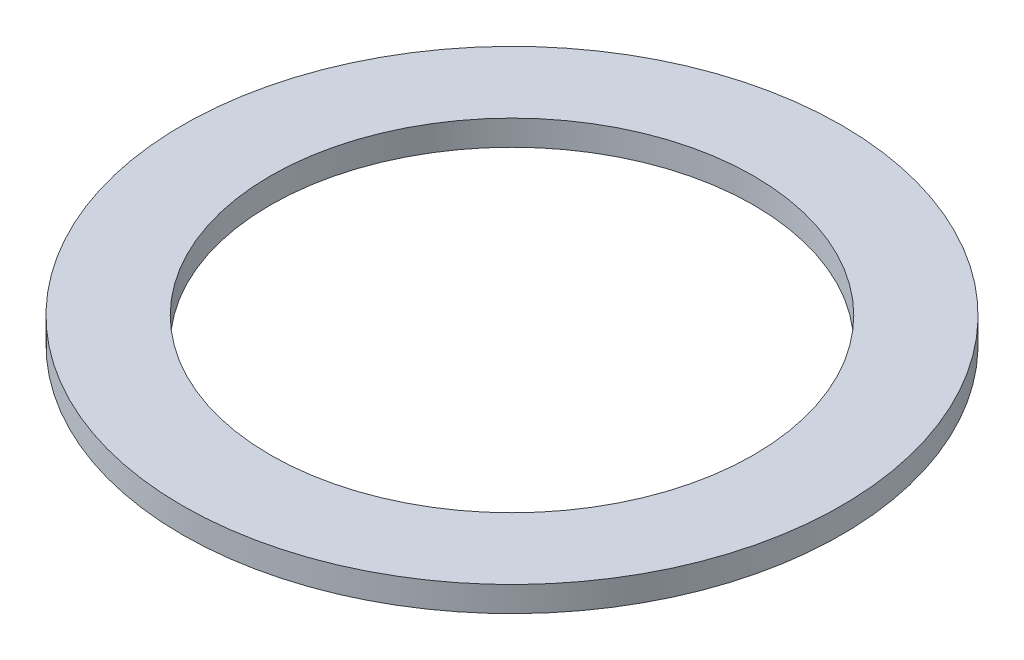
ISO-10303-21;
HEADER;
FILE_DESCRIPTION(('STEP AP214'),'2;1');
FILE_NAME('part.step','',(''),(''),'','','');
FILE_SCHEMA(('AUTOMOTIVE_DESIGN { 1 0 10303 214 1 1 1 1 }'));
ENDSEC;
DATA;
#1=APPLICATION_CONTEXT('core data for automotive mechanical design processes');
#2=APPLICATION_PROTOCOL_DEFINITION('international standard','automotive_design',2000,#1);
#3=PRODUCT_CONTEXT('',#1,'mechanical');
#4=PRODUCT('Part','Part','',(#3));
#5=PRODUCT_RELATED_PRODUCT_CATEGORY('part','',(#4));
#6=PRODUCT_DEFINITION_FORMATION('','',#4);
#7=PRODUCT_DEFINITION_CONTEXT('part definition',#1,'design');
#8=PRODUCT_DEFINITION('design','',#6,#7);
#9=PRODUCT_DEFINITION_SHAPE('','',#8);
#10=(LENGTH_UNIT() NAMED_UNIT(*) SI_UNIT(.MILLI.,.METRE.));
#11=(NAMED_UNIT(*) PLANE_ANGLE_UNIT() SI_UNIT($,.RADIAN.));
#12=(NAMED_UNIT(*) SI_UNIT($,.STERADIAN.) SOLID_ANGLE_UNIT());
#13=UNCERTAINTY_MEASURE_WITH_UNIT(LENGTH_MEASURE(1.E-05),#10,'distance_accuracy_value','');
#14=(GEOMETRIC_REPRESENTATION_CONTEXT(3) GLOBAL_UNCERTAINTY_ASSIGNED_CONTEXT((#13)) GLOBAL_UNIT_ASSIGNED_CONTEXT((#10,
#11,#12)) REPRESENTATION_CONTEXT('',''));
#15=CARTESIAN_POINT('',(0.,0.,0.));
#16=DIRECTION('',(0.,0.,1.));
#17=DIRECTION('',(1.,0.,0.));
#18=AXIS2_PLACEMENT_3D('',#15,#16,#17);
#19=CARTESIAN_POINT('',(0.,2.87,0.));
#20=DIRECTION('',(0.,1.,0.));
#21=DIRECTION('',(0.,0.,1.));
#22=AXIS2_PLACEMENT_3D('',#19,#20,#21);
#23=PLANE('',#22);
#24=CARTESIAN_POINT('',(0.,2.87,0.));
#25=DIRECTION('',(0.,1.,0.));
#26=DIRECTION('',(0.,0.,1.));
#27=AXIS2_PLACEMENT_3D('',#24,#25,#26);
#28=CIRCLE('',#27,37.5);
#29=CARTESIAN_POINT('',(0.,2.87,37.5));
#30=VERTEX_POINT('',#29);
#31=EDGE_CURVE('E10',#30,#30,#28,.T.);
#32=ORIENTED_EDGE('',*,*,#31,.T.);
#33=EDGE_LOOP('',(#32));
#34=FACE_BOUND('',#33,.T.);
#35=CARTESIAN_POINT('',(0.,2.87,0.));
#36=DIRECTION('',(0.,1.,0.));
#37=DIRECTION('',(0.,0.,1.));
#38=AXIS2_PLACEMENT_3D('',#35,#36,#37);
#39=CIRCLE('',#38,27.5);
#40=CARTESIAN_POINT('',(0.,2.87,27.5));
#41=VERTEX_POINT('',#40);
#42=EDGE_CURVE('E42',#41,#41,#39,.T.);
#43=ORIENTED_EDGE('',*,*,#42,.F.);
#44=EDGE_LOOP('',(#43));
#45=FACE_BOUND('',#44,.T.);
#46=ADVANCED_FACE('F31',(#34,#45),#23,.T.);
#47=CARTESIAN_POINT('',(0.,0.,0.));
#48=DIRECTION('',(0.,1.,0.));
#49=DIRECTION('',(0.,0.,1.));
#50=AXIS2_PLACEMENT_3D('',#47,#48,#49);
#51=PLANE('',#50);
#52=CARTESIAN_POINT('',(0.,0.,0.));
#53=DIRECTION('',(0.,1.,0.));
#54=DIRECTION('',(0.,0.,1.));
#55=AXIS2_PLACEMENT_3D('',#52,#53,#54);
#56=CIRCLE('',#55,37.5);
#57=CARTESIAN_POINT('',(0.,0.,37.5));
#58=VERTEX_POINT('',#57);
#59=EDGE_CURVE('E35',#58,#58,#56,.T.);
#60=ORIENTED_EDGE('',*,*,#59,.F.);
#61=EDGE_LOOP('',(#60));
#62=FACE_BOUND('',#61,.T.);
#63=CARTESIAN_POINT('',(0.,0.,0.));
#64=DIRECTION('',(0.,1.,0.));
#65=DIRECTION('',(0.,0.,1.));
#66=AXIS2_PLACEMENT_3D('',#63,#64,#65);
#67=CIRCLE('',#66,27.5);
#68=CARTESIAN_POINT('',(0.,0.,27.5));
#69=VERTEX_POINT('',#68);
#70=EDGE_CURVE('E44',#69,#69,#67,.T.);
#71=ORIENTED_EDGE('',*,*,#70,.T.);
#72=EDGE_LOOP('',(#71));
#73=FACE_BOUND('',#72,.T.);
#74=ADVANCED_FACE('F54',(#62,#73),#51,.F.);
#75=CARTESIAN_POINT('',(0.,2.87,0.));
#76=DIRECTION('',(0.,-1.,0.));
#77=DIRECTION('',(0.,0.,-1.));
#78=AXIS2_PLACEMENT_3D('',#75,#76,#77);
#79=CYLINDRICAL_SURFACE('',#78,37.5);
#80=ORIENTED_EDGE('',*,*,#31,.F.);
#81=EDGE_LOOP('',(#80));
#82=FACE_BOUND('',#81,.T.);
#83=ORIENTED_EDGE('',*,*,#59,.T.);
#84=EDGE_LOOP('',(#83));
#85=FACE_BOUND('',#84,.T.);
#86=ADVANCED_FACE('F33',(#82,#85),#79,.T.);
#87=CARTESIAN_POINT('',(0.,2.87,0.));
#88=DIRECTION('',(0.,-1.,0.));
#89=DIRECTION('',(0.,0.,-1.));
#90=AXIS2_PLACEMENT_3D('',#87,#88,#89);
#91=CYLINDRICAL_SURFACE('',#90,27.5);
#92=ORIENTED_EDGE('',*,*,#42,.T.);
#93=EDGE_LOOP('',(#92));
#94=FACE_BOUND('',#93,.T.);
#95=ORIENTED_EDGE('',*,*,#70,.F.);
#96=EDGE_LOOP('',(#95));
#97=FACE_BOUND('',#96,.T.);
#98=ADVANCED_FACE('F50',(#94,#97),#91,.F.);
#99=CLOSED_SHELL('',(#46,#74,#86,#98));
#100=MANIFOLD_SOLID_BREP('B2',#99);
#101=ADVANCED_BREP_SHAPE_REPRESENTATION('',(#18,#100),#14);
#102=SHAPE_DEFINITION_REPRESENTATION(#9,#101);
ENDSEC;
END-ISO-10303-21;
